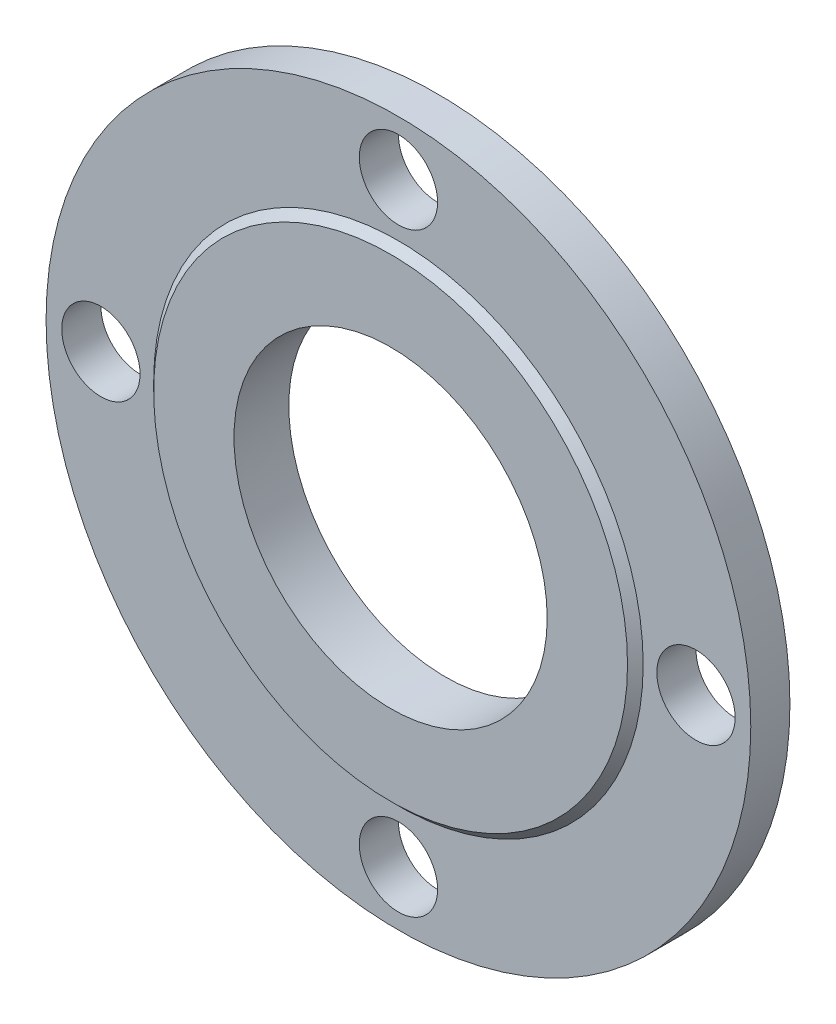
ISO-10303-21;
HEADER;
FILE_DESCRIPTION(('STEP AP214'),'2;1');
FILE_NAME('part.step','',(''),(''),'','','');
FILE_SCHEMA(('AUTOMOTIVE_DESIGN { 1 0 10303 214 1 1 1 1 }'));
ENDSEC;
DATA;
#1=APPLICATION_CONTEXT('core data for automotive mechanical design processes');
#2=APPLICATION_PROTOCOL_DEFINITION('international standard','automotive_design',2000,#1);
#3=PRODUCT_CONTEXT('',#1,'mechanical');
#4=PRODUCT('Part','Part','',(#3));
#5=PRODUCT_RELATED_PRODUCT_CATEGORY('part','',(#4));
#6=PRODUCT_DEFINITION_FORMATION('','',#4);
#7=PRODUCT_DEFINITION_CONTEXT('part definition',#1,'design');
#8=PRODUCT_DEFINITION('design','',#6,#7);
#9=PRODUCT_DEFINITION_SHAPE('','',#8);
#10=(LENGTH_UNIT() NAMED_UNIT(*) SI_UNIT(.MILLI.,.METRE.));
#11=(NAMED_UNIT(*) PLANE_ANGLE_UNIT() SI_UNIT($,.RADIAN.));
#12=(NAMED_UNIT(*) SI_UNIT($,.STERADIAN.) SOLID_ANGLE_UNIT());
#13=UNCERTAINTY_MEASURE_WITH_UNIT(LENGTH_MEASURE(1.E-05),#10,'distance_accuracy_value','');
#14=(GEOMETRIC_REPRESENTATION_CONTEXT(3) GLOBAL_UNCERTAINTY_ASSIGNED_CONTEXT((#13)) GLOBAL_UNIT_ASSIGNED_CONTEXT((#10,
#11,#12)) REPRESENTATION_CONTEXT('',''));
#15=CARTESIAN_POINT('',(0.,0.,0.));
#16=DIRECTION('',(0.,0.,1.));
#17=DIRECTION('',(1.,0.,0.));
#18=AXIS2_PLACEMENT_3D('',#15,#16,#17);
#19=CARTESIAN_POINT('',(0.,0.,2.2225));
#20=DIRECTION('',(0.,0.,1.));
#21=DIRECTION('',(1.,0.,0.));
#22=AXIS2_PLACEMENT_3D('',#19,#20,#21);
#23=PLANE('',#22);
#24=CARTESIAN_POINT('',(0.,0.,2.2225));
#25=DIRECTION('',(0.,0.,1.));
#26=DIRECTION('',(1.,0.,0.));
#27=AXIS2_PLACEMENT_3D('',#24,#25,#26);
#28=CIRCLE('',#27,19.2151);
#29=CARTESIAN_POINT('',(19.2151,0.,2.2225));
#30=VERTEX_POINT('',#29);
#31=EDGE_CURVE('E11',#30,#30,#28,.T.);
#32=ORIENTED_EDGE('',*,*,#31,.T.);
#33=EDGE_LOOP('',(#32));
#34=FACE_BOUND('',#33,.T.);
#35=CARTESIAN_POINT('',(0.,0.,2.2225));
#36=DIRECTION('',(0.,0.,1.));
#37=DIRECTION('',(1.,0.,0.));
#38=AXIS2_PLACEMENT_3D('',#35,#36,#37);
#39=CIRCLE('',#38,12.7);
#40=CARTESIAN_POINT('',(12.7,0.,2.2225));
#41=VERTEX_POINT('',#40);
#42=EDGE_CURVE('E70',#41,#41,#39,.T.);
#43=ORIENTED_EDGE('',*,*,#42,.F.);
#44=EDGE_LOOP('',(#43));
#45=FACE_BOUND('',#44,.T.);
#46=ADVANCED_FACE('F50',(#34,#45),#23,.T.);
#47=CARTESIAN_POINT('',(0.,0.,-2.2225));
#48=DIRECTION('',(0.,0.,1.));
#49=DIRECTION('',(1.,0.,0.));
#50=AXIS2_PLACEMENT_3D('',#47,#48,#49);
#51=PLANE('',#50);
#52=CARTESIAN_POINT('',(0.,0.,-2.2225));
#53=DIRECTION('',(0.,0.,1.));
#54=DIRECTION('',(1.,0.,0.));
#55=AXIS2_PLACEMENT_3D('',#52,#53,#54);
#56=CIRCLE('',#55,19.2151);
#57=CARTESIAN_POINT('',(19.2151,0.,-2.2225));
#58=VERTEX_POINT('',#57);
#59=EDGE_CURVE('E57',#58,#58,#56,.F.);
#60=ORIENTED_EDGE('',*,*,#59,.T.);
#61=EDGE_LOOP('',(#60));
#62=FACE_BOUND('',#61,.T.);
#63=CARTESIAN_POINT('',(0.,0.,-2.2225));
#64=DIRECTION('',(0.,0.,1.));
#65=DIRECTION('',(1.,0.,0.));
#66=AXIS2_PLACEMENT_3D('',#63,#64,#65);
#67=CIRCLE('',#66,12.7);
#68=CARTESIAN_POINT('',(12.7,0.,-2.2225));
#69=VERTEX_POINT('',#68);
#70=EDGE_CURVE('E71',#69,#69,#67,.T.);
#71=ORIENTED_EDGE('',*,*,#70,.T.);
#72=EDGE_LOOP('',(#71));
#73=FACE_BOUND('',#72,.T.);
#74=ADVANCED_FACE('F81',(#62,#73),#51,.F.);
#75=CARTESIAN_POINT('',(0.,0.,2.2225));
#76=DIRECTION('',(0.,0.,-1.));
#77=DIRECTION('',(-1.,0.,0.));
#78=AXIS2_PLACEMENT_3D('',#75,#76,#77);
#79=CYLINDRICAL_SURFACE('',#78,19.8501);
#80=CARTESIAN_POINT('',(0.,0.,-1.58749999999999));
#81=DIRECTION('',(0.,0.,1.));
#82=DIRECTION('',(1.,0.,0.));
#83=AXIS2_PLACEMENT_3D('',#80,#81,#82);
#84=CIRCLE('',#83,19.8501);
#85=CARTESIAN_POINT('',(19.8501,0.,-1.58749999999999));
#86=VERTEX_POINT('',#85);
#87=EDGE_CURVE('E61',#86,#86,#84,.T.);
#88=ORIENTED_EDGE('',*,*,#87,.T.);
#89=EDGE_LOOP('',(#88));
#90=FACE_BOUND('',#89,.T.);
#91=CARTESIAN_POINT('',(0.,0.,1.58749999999998));
#92=DIRECTION('',(0.,0.,1.));
#93=DIRECTION('',(1.,0.,0.));
#94=AXIS2_PLACEMENT_3D('',#91,#92,#93);
#95=CIRCLE('',#94,19.8501);
#96=CARTESIAN_POINT('',(19.8501,0.,1.58749999999998));
#97=VERTEX_POINT('',#96);
#98=EDGE_CURVE('E65',#97,#97,#95,.F.);
#99=ORIENTED_EDGE('',*,*,#98,.T.);
#100=EDGE_LOOP('',(#99));
#101=FACE_BOUND('',#100,.T.);
#102=ADVANCED_FACE('F86',(#90,#101),#79,.T.);
#103=CARTESIAN_POINT('',(0.,0.,2.2225));
#104=DIRECTION('',(0.,0.,-1.));
#105=DIRECTION('',(-1.,0.,0.));
#106=AXIS2_PLACEMENT_3D('',#103,#104,#105);
#107=CYLINDRICAL_SURFACE('',#106,12.7);
#108=ORIENTED_EDGE('',*,*,#42,.T.);
#109=EDGE_LOOP('',(#108));
#110=FACE_BOUND('',#109,.T.);
#111=ORIENTED_EDGE('',*,*,#70,.F.);
#112=EDGE_LOOP('',(#111));
#113=FACE_BOUND('',#112,.T.);
#114=ADVANCED_FACE('F77',(#110,#113),#107,.F.);
#115=CARTESIAN_POINT('',(0.,0.,-1.58749999999999));
#116=DIRECTION('',(0.,0.,1.));
#117=DIRECTION('',(1.,0.,0.));
#118=AXIS2_PLACEMENT_3D('',#115,#116,#117);
#119=CONICAL_SURFACE('',#118,19.8501,0.785398163397448);
#120=ORIENTED_EDGE('',*,*,#59,.F.);
#121=EDGE_LOOP('',(#120));
#122=FACE_BOUND('',#121,.T.);
#123=ORIENTED_EDGE('',*,*,#87,.F.);
#124=EDGE_LOOP('',(#123));
#125=FACE_BOUND('',#124,.T.);
#126=ADVANCED_FACE('F92',(#122,#125),#119,.T.);
#127=CARTESIAN_POINT('',(0.,0.,2.2225));
#128=DIRECTION('',(0.,0.,-1.));
#129=DIRECTION('',(-1.,0.,0.));
#130=AXIS2_PLACEMENT_3D('',#127,#128,#129);
#131=CONICAL_SURFACE('',#130,19.2151,0.785398163397443);
#132=ORIENTED_EDGE('',*,*,#98,.F.);
#133=EDGE_LOOP('',(#132));
#134=FACE_BOUND('',#133,.T.);
#135=ORIENTED_EDGE('',*,*,#31,.F.);
#136=EDGE_LOOP('',(#135));
#137=FACE_BOUND('',#136,.T.);
#138=ADVANCED_FACE('F52',(#134,#137),#131,.T.);
#139=CLOSED_SHELL('',(#46,#74,#102,#114,#126,#138));
#140=MANIFOLD_SOLID_BREP('B2',#139);
#141=CARTESIAN_POINT('',(0.,0.,1.5875));
#142=DIRECTION('',(0.,0.,1.));
#143=DIRECTION('',(1.,0.,0.));
#144=AXIS2_PLACEMENT_3D('',#141,#142,#143);
#145=PLANE('',#144);
#146=CARTESIAN_POINT('',(0.,24.13,1.5875));
#147=DIRECTION('',(0.,0.,1.));
#148=DIRECTION('',(1.,0.,0.));
#149=AXIS2_PLACEMENT_3D('',#146,#147,#148);
#150=CIRCLE('',#149,3.175);
#151=CARTESIAN_POINT('',(3.175,24.13,1.5875));
#152=VERTEX_POINT('',#151);
#153=EDGE_CURVE('E208',#152,#152,#150,.T.);
#154=ORIENTED_EDGE('',*,*,#153,.F.);
#155=EDGE_LOOP('',(#154));
#156=FACE_BOUND('',#155,.T.);
#157=CARTESIAN_POINT('',(24.13,0.,1.5875));
#158=DIRECTION('',(0.,0.,1.));
#159=DIRECTION('',(1.,0.,0.));
#160=AXIS2_PLACEMENT_3D('',#157,#158,#159);
#161=CIRCLE('',#160,3.175);
#162=CARTESIAN_POINT('',(27.305,0.,1.5875));
#163=VERTEX_POINT('',#162);
#164=EDGE_CURVE('E386',#163,#163,#161,.T.);
#165=ORIENTED_EDGE('',*,*,#164,.F.);
#166=EDGE_LOOP('',(#165));
#167=FACE_BOUND('',#166,.T.);
#168=CARTESIAN_POINT('',(0.,-24.13,1.5875));
#169=DIRECTION('',(0.,0.,1.));
#170=DIRECTION('',(1.,0.,0.));
#171=AXIS2_PLACEMENT_3D('',#168,#169,#170);
#172=CIRCLE('',#171,3.175);
#173=CARTESIAN_POINT('',(3.175,-24.13,1.5875));
#174=VERTEX_POINT('',#173);
#175=EDGE_CURVE('E255',#174,#174,#172,.T.);
#176=ORIENTED_EDGE('',*,*,#175,.F.);
#177=EDGE_LOOP('',(#176));
#178=FACE_BOUND('',#177,.T.);
#179=CARTESIAN_POINT('',(-24.13,0.,1.5875));
#180=DIRECTION('',(0.,0.,1.));
#181=DIRECTION('',(1.,0.,0.));
#182=AXIS2_PLACEMENT_3D('',#179,#180,#181);
#183=CIRCLE('',#182,3.175);
#184=CARTESIAN_POINT('',(-20.955,0.,1.5875));
#185=VERTEX_POINT('',#184);
#186=EDGE_CURVE('E387',#185,#185,#183,.T.);
#187=ORIENTED_EDGE('',*,*,#186,.F.);
#188=EDGE_LOOP('',(#187));
#189=FACE_BOUND('',#188,.T.);
#190=CARTESIAN_POINT('',(0.,0.,1.5875));
#191=DIRECTION('',(0.,0.,1.));
#192=DIRECTION('',(1.,0.,0.));
#193=AXIS2_PLACEMENT_3D('',#190,#191,#192);
#194=CIRCLE('',#193,19.8501);
#195=CARTESIAN_POINT('',(19.8501,0.,1.5875));
#196=VERTEX_POINT('',#195);
#197=EDGE_CURVE('E196',#196,#196,#194,.T.);
#198=ORIENTED_EDGE('',*,*,#197,.F.);
#199=EDGE_LOOP('',(#198));
#200=FACE_BOUND('',#199,.T.);
#201=CARTESIAN_POINT('',(0.,0.,1.5875));
#202=DIRECTION('',(0.,0.,1.));
#203=DIRECTION('',(1.,0.,0.));
#204=AXIS2_PLACEMENT_3D('',#201,#202,#203);
#205=CIRCLE('',#204,28.575);
#206=CARTESIAN_POINT('',(28.575,0.,1.5875));
#207=VERTEX_POINT('',#206);
#208=EDGE_CURVE('E49',#207,#207,#205,.T.);
#209=ORIENTED_EDGE('',*,*,#208,.T.);
#210=EDGE_LOOP('',(#209));
#211=FACE_BOUND('',#210,.T.);
#212=ADVANCED_FACE('F183',(#156,#167,#178,#189,#200,#211),#145,.T.);
#213=CARTESIAN_POINT('',(0.,0.,-1.5875));
#214=DIRECTION('',(0.,0.,1.));
#215=DIRECTION('',(1.,0.,0.));
#216=AXIS2_PLACEMENT_3D('',#213,#214,#215);
#217=PLANE('',#216);
#218=CARTESIAN_POINT('',(0.,24.13,-1.5875));
#219=DIRECTION('',(0.,0.,1.));
#220=DIRECTION('',(1.,0.,0.));
#221=AXIS2_PLACEMENT_3D('',#218,#219,#220);
#222=CIRCLE('',#221,3.175);
#223=CARTESIAN_POINT('',(3.175,24.13,-1.5875));
#224=VERTEX_POINT('',#223);
#225=EDGE_CURVE('E187',#224,#224,#222,.T.);
#226=ORIENTED_EDGE('',*,*,#225,.T.);
#227=EDGE_LOOP('',(#226));
#228=FACE_BOUND('',#227,.T.);
#229=CARTESIAN_POINT('',(24.13,0.,-1.5875));
#230=DIRECTION('',(0.,0.,1.));
#231=DIRECTION('',(1.,0.,0.));
#232=AXIS2_PLACEMENT_3D('',#229,#230,#231);
#233=CIRCLE('',#232,3.175);
#234=CARTESIAN_POINT('',(27.305,0.,-1.5875));
#235=VERTEX_POINT('',#234);
#236=EDGE_CURVE('E210',#235,#235,#233,.T.);
#237=ORIENTED_EDGE('',*,*,#236,.T.);
#238=EDGE_LOOP('',(#237));
#239=FACE_BOUND('',#238,.T.);
#240=CARTESIAN_POINT('',(0.,-24.13,-1.5875));
#241=DIRECTION('',(0.,0.,1.));
#242=DIRECTION('',(1.,0.,0.));
#243=AXIS2_PLACEMENT_3D('',#240,#241,#242);
#244=CIRCLE('',#243,3.175);
#245=CARTESIAN_POINT('',(3.175,-24.13,-1.5875));
#246=VERTEX_POINT('',#245);
#247=EDGE_CURVE('E207',#246,#246,#244,.T.);
#248=ORIENTED_EDGE('',*,*,#247,.T.);
#249=EDGE_LOOP('',(#248));
#250=FACE_BOUND('',#249,.T.);
#251=CARTESIAN_POINT('',(-24.13,0.,-1.5875));
#252=DIRECTION('',(0.,0.,1.));
#253=DIRECTION('',(1.,0.,0.));
#254=AXIS2_PLACEMENT_3D('',#251,#252,#253);
#255=CIRCLE('',#254,3.175);
#256=CARTESIAN_POINT('',(-20.955,0.,-1.5875));
#257=VERTEX_POINT('',#256);
#258=EDGE_CURVE('E204',#257,#257,#255,.T.);
#259=ORIENTED_EDGE('',*,*,#258,.T.);
#260=EDGE_LOOP('',(#259));
#261=FACE_BOUND('',#260,.T.);
#262=CARTESIAN_POINT('',(0.,0.,-1.5875));
#263=DIRECTION('',(0.,0.,1.));
#264=DIRECTION('',(1.,0.,0.));
#265=AXIS2_PLACEMENT_3D('',#262,#263,#264);
#266=CIRCLE('',#265,19.8501);
#267=CARTESIAN_POINT('',(19.8501,0.,-1.5875));
#268=VERTEX_POINT('',#267);
#269=EDGE_CURVE('E201',#268,#268,#266,.T.);
#270=ORIENTED_EDGE('',*,*,#269,.T.);
#271=EDGE_LOOP('',(#270));
#272=FACE_BOUND('',#271,.T.);
#273=CARTESIAN_POINT('',(0.,0.,-1.5875));
#274=DIRECTION('',(0.,0.,1.));
#275=DIRECTION('',(1.,0.,0.));
#276=AXIS2_PLACEMENT_3D('',#273,#274,#275);
#277=CIRCLE('',#276,28.575);
#278=CARTESIAN_POINT('',(28.575,0.,-1.5875));
#279=VERTEX_POINT('',#278);
#280=EDGE_CURVE('E191',#279,#279,#277,.T.);
#281=ORIENTED_EDGE('',*,*,#280,.F.);
#282=EDGE_LOOP('',(#281));
#283=FACE_BOUND('',#282,.T.);
#284=ADVANCED_FACE('F217',(#228,#239,#250,#261,#272,#283),#217,.F.);
#285=CARTESIAN_POINT('',(0.,0.,1.5875));
#286=DIRECTION('',(0.,0.,-1.));
#287=DIRECTION('',(-1.,0.,0.));
#288=AXIS2_PLACEMENT_3D('',#285,#286,#287);
#289=CYLINDRICAL_SURFACE('',#288,28.575);
#290=ORIENTED_EDGE('',*,*,#208,.F.);
#291=EDGE_LOOP('',(#290));
#292=FACE_BOUND('',#291,.T.);
#293=ORIENTED_EDGE('',*,*,#280,.T.);
#294=EDGE_LOOP('',(#293));
#295=FACE_BOUND('',#294,.T.);
#296=ADVANCED_FACE('F185',(#292,#295),#289,.T.);
#297=CARTESIAN_POINT('',(0.,0.,-2.2225));
#298=DIRECTION('',(0.,0.,1.));
#299=DIRECTION('',(1.,0.,0.));
#300=AXIS2_PLACEMENT_3D('',#297,#298,#299);
#301=CYLINDRICAL_SURFACE('',#300,19.8501);
#302=ORIENTED_EDGE('',*,*,#197,.T.);
#303=EDGE_LOOP('',(#302));
#304=FACE_BOUND('',#303,.T.);
#305=ORIENTED_EDGE('',*,*,#269,.F.);
#306=EDGE_LOOP('',(#305));
#307=FACE_BOUND('',#306,.T.);
#308=ADVANCED_FACE('F240',(#304,#307),#301,.F.);
#309=CARTESIAN_POINT('',(-24.13,0.,-2.2225));
#310=DIRECTION('',(0.,0.,1.));
#311=DIRECTION('',(1.,0.,0.));
#312=AXIS2_PLACEMENT_3D('',#309,#310,#311);
#313=CYLINDRICAL_SURFACE('',#312,3.175);
#314=CARTESIAN_POINT('',(-20.955,0.,1.5875));
#315=CARTESIAN_POINT('',(-20.955,0.,1.55442708333333));
#316=CARTESIAN_POINT('',(-20.955,0.,1.52135416666667));
#317=CARTESIAN_POINT('',(-20.955,0.,1.45520833333333));
#318=CARTESIAN_POINT('',(-20.955,0.,1.42213541666667));
#319=CARTESIAN_POINT('',(-20.955,0.,1.35598958333333));
#320=CARTESIAN_POINT('',(-20.955,0.,1.32291666666667));
#321=CARTESIAN_POINT('',(-20.955,0.,1.25677083333333));
#322=CARTESIAN_POINT('',(-20.955,0.,1.22369791666667));
#323=CARTESIAN_POINT('',(-20.955,0.,1.15755208333333));
#324=CARTESIAN_POINT('',(-20.955,0.,1.12447916666667));
#325=CARTESIAN_POINT('',(-20.955,0.,1.05833333333333));
#326=CARTESIAN_POINT('',(-20.955,0.,1.02526041666667));
#327=CARTESIAN_POINT('',(-20.955,0.,0.959114583333333));
#328=CARTESIAN_POINT('',(-20.955,0.,0.926041666666667));
#329=CARTESIAN_POINT('',(-20.955,0.,0.859895833333333));
#330=CARTESIAN_POINT('',(-20.955,0.,0.826822916666667));
#331=CARTESIAN_POINT('',(-20.955,0.,0.760677083333333));
#332=CARTESIAN_POINT('',(-20.955,0.,0.727604166666666));
#333=CARTESIAN_POINT('',(-20.955,0.,0.661458333333333));
#334=CARTESIAN_POINT('',(-20.955,0.,0.628385416666666));
#335=CARTESIAN_POINT('',(-20.955,0.,0.562239583333333));
#336=CARTESIAN_POINT('',(-20.955,0.,0.529166666666666));
#337=CARTESIAN_POINT('',(-20.955,0.,0.463020833333333));
#338=CARTESIAN_POINT('',(-20.955,0.,0.429947916666667));
#339=CARTESIAN_POINT('',(-20.955,0.,0.363802083333333));
#340=CARTESIAN_POINT('',(-20.955,0.,0.330729166666667));
#341=CARTESIAN_POINT('',(-20.955,0.,0.264583333333333));
#342=CARTESIAN_POINT('',(-20.955,0.,0.231510416666666));
#343=CARTESIAN_POINT('',(-20.955,0.,0.165364583333333));
#344=CARTESIAN_POINT('',(-20.955,0.,0.132291666666667));
#345=CARTESIAN_POINT('',(-20.955,0.,0.0661458333333331));
#346=CARTESIAN_POINT('',(-20.955,0.,0.0330729166666663));
#347=CARTESIAN_POINT('',(-20.955,0.,-0.0330729166666669));
#348=CARTESIAN_POINT('',(-20.955,0.,-0.0661458333333334));
#349=CARTESIAN_POINT('',(-20.955,0.,-0.132291666666667));
#350=CARTESIAN_POINT('',(-20.955,0.,-0.165364583333334));
#351=CARTESIAN_POINT('',(-20.955,0.,-0.231510416666667));
#352=CARTESIAN_POINT('',(-20.955,0.,-0.264583333333333));
#353=CARTESIAN_POINT('',(-20.955,0.,-0.330729166666667));
#354=CARTESIAN_POINT('',(-20.955,0.,-0.363802083333333));
#355=CARTESIAN_POINT('',(-20.955,0.,-0.429947916666667));
#356=CARTESIAN_POINT('',(-20.955,0.,-0.463020833333333));
#357=CARTESIAN_POINT('',(-20.955,0.,-0.529166666666667));
#358=CARTESIAN_POINT('',(-20.955,0.,-0.562239583333334));
#359=CARTESIAN_POINT('',(-20.955,0.,-0.628385416666667));
#360=CARTESIAN_POINT('',(-20.955,0.,-0.661458333333333));
#361=CARTESIAN_POINT('',(-20.955,0.,-0.727604166666667));
#362=CARTESIAN_POINT('',(-20.955,0.,-0.760677083333333));
#363=CARTESIAN_POINT('',(-20.955,0.,-0.826822916666667));
#364=CARTESIAN_POINT('',(-20.955,0.,-0.859895833333333));
#365=CARTESIAN_POINT('',(-20.955,0.,-0.926041666666667));
#366=CARTESIAN_POINT('',(-20.955,0.,-0.959114583333333));
#367=CARTESIAN_POINT('',(-20.955,0.,-1.02526041666667));
#368=CARTESIAN_POINT('',(-20.955,0.,-1.05833333333333));
#369=CARTESIAN_POINT('',(-20.955,0.,-1.12447916666667));
#370=CARTESIAN_POINT('',(-20.955,0.,-1.15755208333333));
#371=CARTESIAN_POINT('',(-20.955,0.,-1.22369791666667));
#372=CARTESIAN_POINT('',(-20.955,0.,-1.25677083333333));
#373=CARTESIAN_POINT('',(-20.955,0.,-1.32291666666667));
#374=CARTESIAN_POINT('',(-20.955,0.,-1.35598958333333));
#375=CARTESIAN_POINT('',(-20.955,0.,-1.42213541666667));
#376=CARTESIAN_POINT('',(-20.955,0.,-1.45520833333333));
#377=CARTESIAN_POINT('',(-20.955,0.,-1.52135416666667));
#378=CARTESIAN_POINT('',(-20.955,0.,-1.55442708333333));
#379=CARTESIAN_POINT('',(-20.955,0.,-1.5875));
#380=B_SPLINE_CURVE_WITH_KNOTS('',3,(#314,#315,#316,#317,#318,#319,#320,#321,#322,#323,#324,
#325,#326,#327,#328,#329,#330,#331,#332,#333,#334,#335,#336,#337,#338,#339,#340,#341,#342,#343,
#344,#345,#346,#347,#348,#349,#350,#351,#352,#353,#354,#355,#356,#357,#358,#359,#360,#361,#362,
#363,#364,#365,#366,#367,#368,#369,#370,#371,#372,#373,#374,#375,#376,#377,#378,#379),
.UNSPECIFIED.,.F.,.F.,(4,2,2,2,2,2,2,2,2,2,2,2,2,2,2,2,2,2,2,2,2,2,2,2,2,2,2,2,2,2,2,2,4),(0.,
0.0992187499999999,0.1984375,0.29765625,0.396875,0.49609375,0.5953125,0.69453125,0.79375,
0.89296875,0.9921875,1.09140625,1.190625,1.28984375,1.3890625,1.48828125,1.5875,1.68671875,
1.7859375,1.88515625,1.984375,2.08359375,2.1828125,2.28203125,2.38125,2.48046875,2.5796875,
2.67890625,2.778125,2.87734375,2.9765625,3.07578125,3.175),.UNSPECIFIED.);
#381=EDGE_CURVE('BSEAM243',#185,#257,#380,.T.);
#382=ORIENTED_EDGE('',*,*,#186,.T.);
#383=ORIENTED_EDGE('',*,*,#258,.F.);
#384=ORIENTED_EDGE('',*,*,#381,.T.);
#385=ORIENTED_EDGE('',*,*,#381,.F.);
#386=EDGE_LOOP('',(#382,#384,#383,#385));
#387=FACE_BOUND('',#386,.T.);
#388=ADVANCED_FACE('F243',(#387),#313,.F.);
#389=CARTESIAN_POINT('',(0.,-24.13,-2.2225));
#390=DIRECTION('',(0.,0.,1.));
#391=DIRECTION('',(1.,0.,0.));
#392=AXIS2_PLACEMENT_3D('',#389,#390,#391);
#393=CYLINDRICAL_SURFACE('',#392,3.175);
#394=CARTESIAN_POINT('',(3.175,-24.13,1.5875));
#395=CARTESIAN_POINT('',(3.175,-24.13,1.55442708333333));
#396=CARTESIAN_POINT('',(3.175,-24.13,1.52135416666667));
#397=CARTESIAN_POINT('',(3.175,-24.13,1.45520833333333));
#398=CARTESIAN_POINT('',(3.175,-24.13,1.42213541666667));
#399=CARTESIAN_POINT('',(3.175,-24.13,1.35598958333333));
#400=CARTESIAN_POINT('',(3.175,-24.13,1.32291666666667));
#401=CARTESIAN_POINT('',(3.175,-24.13,1.25677083333333));
#402=CARTESIAN_POINT('',(3.175,-24.13,1.22369791666667));
#403=CARTESIAN_POINT('',(3.175,-24.13,1.15755208333333));
#404=CARTESIAN_POINT('',(3.175,-24.13,1.12447916666667));
#405=CARTESIAN_POINT('',(3.175,-24.13,1.05833333333333));
#406=CARTESIAN_POINT('',(3.175,-24.13,1.02526041666667));
#407=CARTESIAN_POINT('',(3.175,-24.13,0.959114583333333));
#408=CARTESIAN_POINT('',(3.175,-24.13,0.926041666666667));
#409=CARTESIAN_POINT('',(3.175,-24.13,0.859895833333333));
#410=CARTESIAN_POINT('',(3.175,-24.13,0.826822916666667));
#411=CARTESIAN_POINT('',(3.175,-24.13,0.760677083333333));
#412=CARTESIAN_POINT('',(3.175,-24.13,0.727604166666666));
#413=CARTESIAN_POINT('',(3.175,-24.13,0.661458333333333));
#414=CARTESIAN_POINT('',(3.175,-24.13,0.628385416666666));
#415=CARTESIAN_POINT('',(3.175,-24.13,0.562239583333333));
#416=CARTESIAN_POINT('',(3.175,-24.13,0.529166666666666));
#417=CARTESIAN_POINT('',(3.175,-24.13,0.463020833333333));
#418=CARTESIAN_POINT('',(3.175,-24.13,0.429947916666667));
#419=CARTESIAN_POINT('',(3.175,-24.13,0.363802083333333));
#420=CARTESIAN_POINT('',(3.175,-24.13,0.330729166666667));
#421=CARTESIAN_POINT('',(3.175,-24.13,0.264583333333333));
#422=CARTESIAN_POINT('',(3.175,-24.13,0.231510416666666));
#423=CARTESIAN_POINT('',(3.175,-24.13,0.165364583333333));
#424=CARTESIAN_POINT('',(3.175,-24.13,0.132291666666667));
#425=CARTESIAN_POINT('',(3.175,-24.13,0.0661458333333331));
#426=CARTESIAN_POINT('',(3.175,-24.13,0.0330729166666663));
#427=CARTESIAN_POINT('',(3.175,-24.13,-0.0330729166666669));
#428=CARTESIAN_POINT('',(3.175,-24.13,-0.0661458333333334));
#429=CARTESIAN_POINT('',(3.175,-24.13,-0.132291666666667));
#430=CARTESIAN_POINT('',(3.175,-24.13,-0.165364583333334));
#431=CARTESIAN_POINT('',(3.175,-24.13,-0.231510416666667));
#432=CARTESIAN_POINT('',(3.175,-24.13,-0.264583333333333));
#433=CARTESIAN_POINT('',(3.175,-24.13,-0.330729166666667));
#434=CARTESIAN_POINT('',(3.175,-24.13,-0.363802083333333));
#435=CARTESIAN_POINT('',(3.175,-24.13,-0.429947916666667));
#436=CARTESIAN_POINT('',(3.175,-24.13,-0.463020833333333));
#437=CARTESIAN_POINT('',(3.175,-24.13,-0.529166666666667));
#438=CARTESIAN_POINT('',(3.175,-24.13,-0.562239583333334));
#439=CARTESIAN_POINT('',(3.175,-24.13,-0.628385416666667));
#440=CARTESIAN_POINT('',(3.175,-24.13,-0.661458333333333));
#441=CARTESIAN_POINT('',(3.175,-24.13,-0.727604166666667));
#442=CARTESIAN_POINT('',(3.175,-24.13,-0.760677083333333));
#443=CARTESIAN_POINT('',(3.175,-24.13,-0.826822916666667));
#444=CARTESIAN_POINT('',(3.175,-24.13,-0.859895833333333));
#445=CARTESIAN_POINT('',(3.175,-24.13,-0.926041666666667));
#446=CARTESIAN_POINT('',(3.175,-24.13,-0.959114583333333));
#447=CARTESIAN_POINT('',(3.175,-24.13,-1.02526041666667));
#448=CARTESIAN_POINT('',(3.175,-24.13,-1.05833333333333));
#449=CARTESIAN_POINT('',(3.175,-24.13,-1.12447916666667));
#450=CARTESIAN_POINT('',(3.175,-24.13,-1.15755208333333));
#451=CARTESIAN_POINT('',(3.175,-24.13,-1.22369791666667));
#452=CARTESIAN_POINT('',(3.175,-24.13,-1.25677083333333));
#453=CARTESIAN_POINT('',(3.175,-24.13,-1.32291666666667));
#454=CARTESIAN_POINT('',(3.175,-24.13,-1.35598958333333));
#455=CARTESIAN_POINT('',(3.175,-24.13,-1.42213541666667));
#456=CARTESIAN_POINT('',(3.175,-24.13,-1.45520833333333));
#457=CARTESIAN_POINT('',(3.175,-24.13,-1.52135416666667));
#458=CARTESIAN_POINT('',(3.175,-24.13,-1.55442708333333));
#459=CARTESIAN_POINT('',(3.175,-24.13,-1.5875));
#460=B_SPLINE_CURVE_WITH_KNOTS('',3,(#394,#395,#396,#397,#398,#399,#400,#401,#402,#403,#404,
#405,#406,#407,#408,#409,#410,#411,#412,#413,#414,#415,#416,#417,#418,#419,#420,#421,#422,#423,
#424,#425,#426,#427,#428,#429,#430,#431,#432,#433,#434,#435,#436,#437,#438,#439,#440,#441,#442,
#443,#444,#445,#446,#447,#448,#449,#450,#451,#452,#453,#454,#455,#456,#457,#458,#459),
.UNSPECIFIED.,.F.,.F.,(4,2,2,2,2,2,2,2,2,2,2,2,2,2,2,2,2,2,2,2,2,2,2,2,2,2,2,2,2,2,2,2,4),(0.,
0.0992187499999999,0.1984375,0.29765625,0.396875,0.49609375,0.5953125,0.69453125,0.79375,
0.89296875,0.9921875,1.09140625,1.190625,1.28984375,1.3890625,1.48828125,1.5875,1.68671875,
1.7859375,1.88515625,1.984375,2.08359375,2.1828125,2.28203125,2.38125,2.48046875,2.5796875,
2.67890625,2.778125,2.87734375,2.9765625,3.07578125,3.175),.UNSPECIFIED.);
#461=EDGE_CURVE('BSEAM227',#174,#246,#460,.T.);
#462=ORIENTED_EDGE('',*,*,#175,.T.);
#463=ORIENTED_EDGE('',*,*,#247,.F.);
#464=ORIENTED_EDGE('',*,*,#461,.T.);
#465=ORIENTED_EDGE('',*,*,#461,.F.);
#466=EDGE_LOOP('',(#462,#464,#463,#465));
#467=FACE_BOUND('',#466,.T.);
#468=ADVANCED_FACE('F227',(#467),#393,.F.);
#469=CARTESIAN_POINT('',(24.13,0.,-2.2225));
#470=DIRECTION('',(0.,0.,1.));
#471=DIRECTION('',(1.,0.,0.));
#472=AXIS2_PLACEMENT_3D('',#469,#470,#471);
#473=CYLINDRICAL_SURFACE('',#472,3.175);
#474=CARTESIAN_POINT('',(27.305,0.,1.5875));
#475=CARTESIAN_POINT('',(27.305,0.,1.55442708333333));
#476=CARTESIAN_POINT('',(27.305,0.,1.52135416666667));
#477=CARTESIAN_POINT('',(27.305,0.,1.45520833333333));
#478=CARTESIAN_POINT('',(27.305,0.,1.42213541666667));
#479=CARTESIAN_POINT('',(27.305,0.,1.35598958333333));
#480=CARTESIAN_POINT('',(27.305,0.,1.32291666666667));
#481=CARTESIAN_POINT('',(27.305,0.,1.25677083333333));
#482=CARTESIAN_POINT('',(27.305,0.,1.22369791666667));
#483=CARTESIAN_POINT('',(27.305,0.,1.15755208333333));
#484=CARTESIAN_POINT('',(27.305,0.,1.12447916666667));
#485=CARTESIAN_POINT('',(27.305,0.,1.05833333333333));
#486=CARTESIAN_POINT('',(27.305,0.,1.02526041666667));
#487=CARTESIAN_POINT('',(27.305,0.,0.959114583333333));
#488=CARTESIAN_POINT('',(27.305,0.,0.926041666666667));
#489=CARTESIAN_POINT('',(27.305,0.,0.859895833333333));
#490=CARTESIAN_POINT('',(27.305,0.,0.826822916666667));
#491=CARTESIAN_POINT('',(27.305,0.,0.760677083333333));
#492=CARTESIAN_POINT('',(27.305,0.,0.727604166666666));
#493=CARTESIAN_POINT('',(27.305,0.,0.661458333333333));
#494=CARTESIAN_POINT('',(27.305,0.,0.628385416666666));
#495=CARTESIAN_POINT('',(27.305,0.,0.562239583333333));
#496=CARTESIAN_POINT('',(27.305,0.,0.529166666666666));
#497=CARTESIAN_POINT('',(27.305,0.,0.463020833333333));
#498=CARTESIAN_POINT('',(27.305,0.,0.429947916666667));
#499=CARTESIAN_POINT('',(27.305,0.,0.363802083333333));
#500=CARTESIAN_POINT('',(27.305,0.,0.330729166666667));
#501=CARTESIAN_POINT('',(27.305,0.,0.264583333333333));
#502=CARTESIAN_POINT('',(27.305,0.,0.231510416666666));
#503=CARTESIAN_POINT('',(27.305,0.,0.165364583333333));
#504=CARTESIAN_POINT('',(27.305,0.,0.132291666666667));
#505=CARTESIAN_POINT('',(27.305,0.,0.0661458333333331));
#506=CARTESIAN_POINT('',(27.305,0.,0.0330729166666663));
#507=CARTESIAN_POINT('',(27.305,0.,-0.0330729166666669));
#508=CARTESIAN_POINT('',(27.305,0.,-0.0661458333333334));
#509=CARTESIAN_POINT('',(27.305,0.,-0.132291666666667));
#510=CARTESIAN_POINT('',(27.305,0.,-0.165364583333334));
#511=CARTESIAN_POINT('',(27.305,0.,-0.231510416666667));
#512=CARTESIAN_POINT('',(27.305,0.,-0.264583333333333));
#513=CARTESIAN_POINT('',(27.305,0.,-0.330729166666667));
#514=CARTESIAN_POINT('',(27.305,0.,-0.363802083333333));
#515=CARTESIAN_POINT('',(27.305,0.,-0.429947916666667));
#516=CARTESIAN_POINT('',(27.305,0.,-0.463020833333333));
#517=CARTESIAN_POINT('',(27.305,0.,-0.529166666666667));
#518=CARTESIAN_POINT('',(27.305,0.,-0.562239583333334));
#519=CARTESIAN_POINT('',(27.305,0.,-0.628385416666667));
#520=CARTESIAN_POINT('',(27.305,0.,-0.661458333333333));
#521=CARTESIAN_POINT('',(27.305,0.,-0.727604166666667));
#522=CARTESIAN_POINT('',(27.305,0.,-0.760677083333333));
#523=CARTESIAN_POINT('',(27.305,0.,-0.826822916666667));
#524=CARTESIAN_POINT('',(27.305,0.,-0.859895833333333));
#525=CARTESIAN_POINT('',(27.305,0.,-0.926041666666667));
#526=CARTESIAN_POINT('',(27.305,0.,-0.959114583333333));
#527=CARTESIAN_POINT('',(27.305,0.,-1.02526041666667));
#528=CARTESIAN_POINT('',(27.305,0.,-1.05833333333333));
#529=CARTESIAN_POINT('',(27.305,0.,-1.12447916666667));
#530=CARTESIAN_POINT('',(27.305,0.,-1.15755208333333));
#531=CARTESIAN_POINT('',(27.305,0.,-1.22369791666667));
#532=CARTESIAN_POINT('',(27.305,0.,-1.25677083333333));
#533=CARTESIAN_POINT('',(27.305,0.,-1.32291666666667));
#534=CARTESIAN_POINT('',(27.305,0.,-1.35598958333333));
#535=CARTESIAN_POINT('',(27.305,0.,-1.42213541666667));
#536=CARTESIAN_POINT('',(27.305,0.,-1.45520833333333));
#537=CARTESIAN_POINT('',(27.305,0.,-1.52135416666667));
#538=CARTESIAN_POINT('',(27.305,0.,-1.55442708333333));
#539=CARTESIAN_POINT('',(27.305,0.,-1.5875));
#540=B_SPLINE_CURVE_WITH_KNOTS('',3,(#474,#475,#476,#477,#478,#479,#480,#481,#482,#483,#484,
#485,#486,#487,#488,#489,#490,#491,#492,#493,#494,#495,#496,#497,#498,#499,#500,#501,#502,#503,
#504,#505,#506,#507,#508,#509,#510,#511,#512,#513,#514,#515,#516,#517,#518,#519,#520,#521,#522,
#523,#524,#525,#526,#527,#528,#529,#530,#531,#532,#533,#534,#535,#536,#537,#538,#539),
.UNSPECIFIED.,.F.,.F.,(4,2,2,2,2,2,2,2,2,2,2,2,2,2,2,2,2,2,2,2,2,2,2,2,2,2,2,2,2,2,2,2,4),(0.,
0.0992187499999999,0.1984375,0.29765625,0.396875,0.49609375,0.5953125,0.69453125,0.79375,
0.89296875,0.9921875,1.09140625,1.190625,1.28984375,1.3890625,1.48828125,1.5875,1.68671875,
1.7859375,1.88515625,1.984375,2.08359375,2.1828125,2.28203125,2.38125,2.48046875,2.5796875,
2.67890625,2.778125,2.87734375,2.9765625,3.07578125,3.175),.UNSPECIFIED.);
#541=EDGE_CURVE('BSEAM221',#163,#235,#540,.T.);
#542=ORIENTED_EDGE('',*,*,#164,.T.);
#543=ORIENTED_EDGE('',*,*,#236,.F.);
#544=ORIENTED_EDGE('',*,*,#541,.T.);
#545=ORIENTED_EDGE('',*,*,#541,.F.);
#546=EDGE_LOOP('',(#542,#544,#543,#545));
#547=FACE_BOUND('',#546,.T.);
#548=ADVANCED_FACE('F221',(#547),#473,.F.);
#549=CARTESIAN_POINT('',(0.,24.13,-2.2225));
#550=DIRECTION('',(0.,0.,1.));
#551=DIRECTION('',(1.,0.,0.));
#552=AXIS2_PLACEMENT_3D('',#549,#550,#551);
#553=CYLINDRICAL_SURFACE('',#552,3.175);
#554=CARTESIAN_POINT('',(3.175,24.13,1.5875));
#555=CARTESIAN_POINT('',(3.175,24.13,1.55442708333333));
#556=CARTESIAN_POINT('',(3.175,24.13,1.52135416666667));
#557=CARTESIAN_POINT('',(3.175,24.13,1.45520833333333));
#558=CARTESIAN_POINT('',(3.175,24.13,1.42213541666667));
#559=CARTESIAN_POINT('',(3.175,24.13,1.35598958333333));
#560=CARTESIAN_POINT('',(3.175,24.13,1.32291666666667));
#561=CARTESIAN_POINT('',(3.175,24.13,1.25677083333333));
#562=CARTESIAN_POINT('',(3.175,24.13,1.22369791666667));
#563=CARTESIAN_POINT('',(3.175,24.13,1.15755208333333));
#564=CARTESIAN_POINT('',(3.175,24.13,1.12447916666667));
#565=CARTESIAN_POINT('',(3.175,24.13,1.05833333333333));
#566=CARTESIAN_POINT('',(3.175,24.13,1.02526041666667));
#567=CARTESIAN_POINT('',(3.175,24.13,0.959114583333333));
#568=CARTESIAN_POINT('',(3.175,24.13,0.926041666666667));
#569=CARTESIAN_POINT('',(3.175,24.13,0.859895833333333));
#570=CARTESIAN_POINT('',(3.175,24.13,0.826822916666667));
#571=CARTESIAN_POINT('',(3.175,24.13,0.760677083333333));
#572=CARTESIAN_POINT('',(3.175,24.13,0.727604166666666));
#573=CARTESIAN_POINT('',(3.175,24.13,0.661458333333333));
#574=CARTESIAN_POINT('',(3.175,24.13,0.628385416666666));
#575=CARTESIAN_POINT('',(3.175,24.13,0.562239583333333));
#576=CARTESIAN_POINT('',(3.175,24.13,0.529166666666666));
#577=CARTESIAN_POINT('',(3.175,24.13,0.463020833333333));
#578=CARTESIAN_POINT('',(3.175,24.13,0.429947916666667));
#579=CARTESIAN_POINT('',(3.175,24.13,0.363802083333333));
#580=CARTESIAN_POINT('',(3.175,24.13,0.330729166666667));
#581=CARTESIAN_POINT('',(3.175,24.13,0.264583333333333));
#582=CARTESIAN_POINT('',(3.175,24.13,0.231510416666666));
#583=CARTESIAN_POINT('',(3.175,24.13,0.165364583333333));
#584=CARTESIAN_POINT('',(3.175,24.13,0.132291666666667));
#585=CARTESIAN_POINT('',(3.175,24.13,0.0661458333333331));
#586=CARTESIAN_POINT('',(3.175,24.13,0.0330729166666663));
#587=CARTESIAN_POINT('',(3.175,24.13,-0.0330729166666669));
#588=CARTESIAN_POINT('',(3.175,24.13,-0.0661458333333334));
#589=CARTESIAN_POINT('',(3.175,24.13,-0.132291666666667));
#590=CARTESIAN_POINT('',(3.175,24.13,-0.165364583333334));
#591=CARTESIAN_POINT('',(3.175,24.13,-0.231510416666667));
#592=CARTESIAN_POINT('',(3.175,24.13,-0.264583333333333));
#593=CARTESIAN_POINT('',(3.175,24.13,-0.330729166666667));
#594=CARTESIAN_POINT('',(3.175,24.13,-0.363802083333333));
#595=CARTESIAN_POINT('',(3.175,24.13,-0.429947916666667));
#596=CARTESIAN_POINT('',(3.175,24.13,-0.463020833333333));
#597=CARTESIAN_POINT('',(3.175,24.13,-0.529166666666667));
#598=CARTESIAN_POINT('',(3.175,24.13,-0.562239583333334));
#599=CARTESIAN_POINT('',(3.175,24.13,-0.628385416666667));
#600=CARTESIAN_POINT('',(3.175,24.13,-0.661458333333333));
#601=CARTESIAN_POINT('',(3.175,24.13,-0.727604166666667));
#602=CARTESIAN_POINT('',(3.175,24.13,-0.760677083333333));
#603=CARTESIAN_POINT('',(3.175,24.13,-0.826822916666667));
#604=CARTESIAN_POINT('',(3.175,24.13,-0.859895833333333));
#605=CARTESIAN_POINT('',(3.175,24.13,-0.926041666666667));
#606=CARTESIAN_POINT('',(3.175,24.13,-0.959114583333333));
#607=CARTESIAN_POINT('',(3.175,24.13,-1.02526041666667));
#608=CARTESIAN_POINT('',(3.175,24.13,-1.05833333333333));
#609=CARTESIAN_POINT('',(3.175,24.13,-1.12447916666667));
#610=CARTESIAN_POINT('',(3.175,24.13,-1.15755208333333));
#611=CARTESIAN_POINT('',(3.175,24.13,-1.22369791666667));
#612=CARTESIAN_POINT('',(3.175,24.13,-1.25677083333333));
#613=CARTESIAN_POINT('',(3.175,24.13,-1.32291666666667));
#614=CARTESIAN_POINT('',(3.175,24.13,-1.35598958333333));
#615=CARTESIAN_POINT('',(3.175,24.13,-1.42213541666667));
#616=CARTESIAN_POINT('',(3.175,24.13,-1.45520833333333));
#617=CARTESIAN_POINT('',(3.175,24.13,-1.52135416666667));
#618=CARTESIAN_POINT('',(3.175,24.13,-1.55442708333333));
#619=CARTESIAN_POINT('',(3.175,24.13,-1.5875));
#620=B_SPLINE_CURVE_WITH_KNOTS('',3,(#554,#555,#556,#557,#558,#559,#560,#561,#562,#563,#564,
#565,#566,#567,#568,#569,#570,#571,#572,#573,#574,#575,#576,#577,#578,#579,#580,#581,#582,#583,
#584,#585,#586,#587,#588,#589,#590,#591,#592,#593,#594,#595,#596,#597,#598,#599,#600,#601,#602,
#603,#604,#605,#606,#607,#608,#609,#610,#611,#612,#613,#614,#615,#616,#617,#618,#619),
.UNSPECIFIED.,.F.,.F.,(4,2,2,2,2,2,2,2,2,2,2,2,2,2,2,2,2,2,2,2,2,2,2,2,2,2,2,2,2,2,2,2,4),(0.,
0.0992187499999999,0.1984375,0.29765625,0.396875,0.49609375,0.5953125,0.69453125,0.79375,
0.89296875,0.9921875,1.09140625,1.190625,1.28984375,1.3890625,1.48828125,1.5875,1.68671875,
1.7859375,1.88515625,1.984375,2.08359375,2.1828125,2.28203125,2.38125,2.48046875,2.5796875,
2.67890625,2.778125,2.87734375,2.9765625,3.07578125,3.175),.UNSPECIFIED.);
#621=EDGE_CURVE('BSEAM219',#152,#224,#620,.T.);
#622=ORIENTED_EDGE('',*,*,#153,.T.);
#623=ORIENTED_EDGE('',*,*,#225,.F.);
#624=ORIENTED_EDGE('',*,*,#621,.T.);
#625=ORIENTED_EDGE('',*,*,#621,.F.);
#626=EDGE_LOOP('',(#622,#624,#623,#625));
#627=FACE_BOUND('',#626,.T.);
#628=ADVANCED_FACE('F219',(#627),#553,.F.);
#629=CLOSED_SHELL('',(#212,#284,#296,#308,#388,#468,#548,#628));
#630=MANIFOLD_SOLID_BREP('B6',#629);
#631=ADVANCED_BREP_SHAPE_REPRESENTATION('',(#18,#140,#630),#14);
#632=SHAPE_DEFINITION_REPRESENTATION(#9,#631);
ENDSEC;
END-ISO-10303-21;
